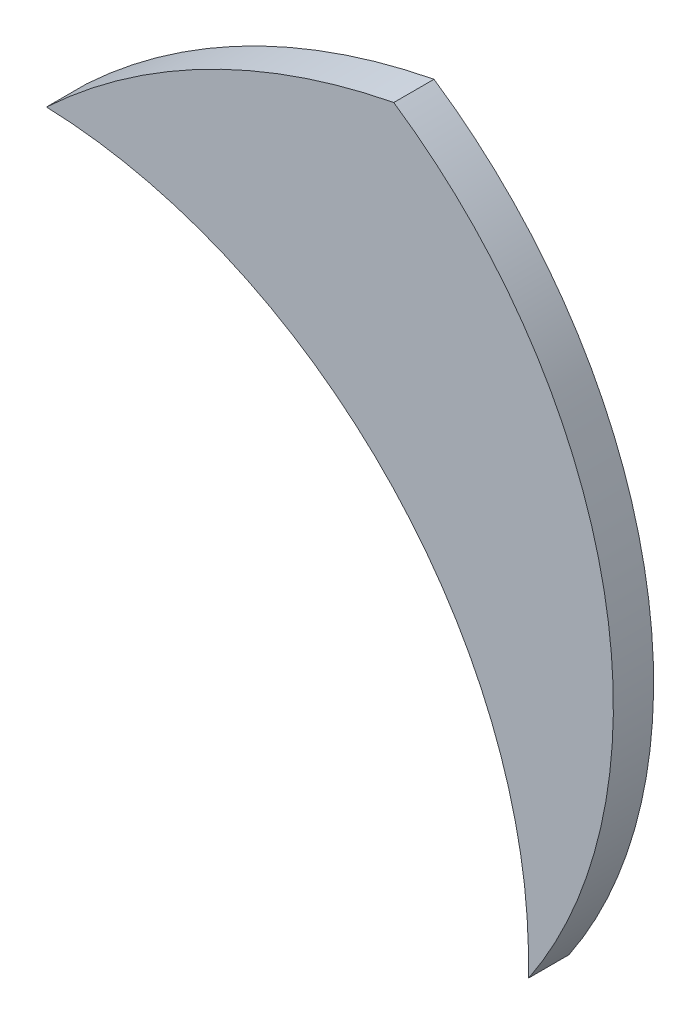
ISO-10303-21;
HEADER;
FILE_DESCRIPTION(('STEP AP214'),'2;1');
FILE_NAME('part.step','',(''),(''),'','','');
FILE_SCHEMA(('AUTOMOTIVE_DESIGN { 1 0 10303 214 1 1 1 1 }'));
ENDSEC;
DATA;
#1=APPLICATION_CONTEXT('core data for automotive mechanical design processes');
#2=APPLICATION_PROTOCOL_DEFINITION('international standard','automotive_design',2000,#1);
#3=PRODUCT_CONTEXT('',#1,'mechanical');
#4=PRODUCT('Part','Part','',(#3));
#5=PRODUCT_RELATED_PRODUCT_CATEGORY('part','',(#4));
#6=PRODUCT_DEFINITION_FORMATION('','',#4);
#7=PRODUCT_DEFINITION_CONTEXT('part definition',#1,'design');
#8=PRODUCT_DEFINITION('design','',#6,#7);
#9=PRODUCT_DEFINITION_SHAPE('','',#8);
#10=(LENGTH_UNIT() NAMED_UNIT(*) SI_UNIT(.MILLI.,.METRE.));
#11=(NAMED_UNIT(*) PLANE_ANGLE_UNIT() SI_UNIT($,.RADIAN.));
#12=(NAMED_UNIT(*) SI_UNIT($,.STERADIAN.) SOLID_ANGLE_UNIT());
#13=UNCERTAINTY_MEASURE_WITH_UNIT(LENGTH_MEASURE(1.E-05),#10,'distance_accuracy_value','');
#14=(GEOMETRIC_REPRESENTATION_CONTEXT(3) GLOBAL_UNCERTAINTY_ASSIGNED_CONTEXT((#13)) GLOBAL_UNIT_ASSIGNED_CONTEXT((#10,
#11,#12)) REPRESENTATION_CONTEXT('',''));
#15=CARTESIAN_POINT('',(0.,0.,0.));
#16=DIRECTION('',(0.,0.,1.));
#17=DIRECTION('',(1.,0.,0.));
#18=AXIS2_PLACEMENT_3D('',#15,#16,#17);
#19=CARTESIAN_POINT('',(-628.291119028019,20.2674554525163,50.8));
#20=DIRECTION('',(0.,0.,-1.));
#21=DIRECTION('',(-1.,0.,0.));
#22=AXIS2_PLACEMENT_3D('',#19,#20,#21);
#23=CYLINDRICAL_SURFACE('',#22,628.617928474841);
#24=CARTESIAN_POINT('',(-628.291119028019,20.2674554525163,0.));
#25=DIRECTION('',(0.,0.,-1.));
#26=DIRECTION('',(-1.,0.,0.));
#27=AXIS2_PLACEMENT_3D('',#24,#25,#26);
#28=CIRCLE('',#27,628.617928474841);
#29=CARTESIAN_POINT('',(-608.023663575502,648.558574480536,0.));
#30=VERTEX_POINT('',#29);
#31=CARTESIAN_POINT('',(0.0351263944543545,1.11988868026384,0.));
#32=VERTEX_POINT('',#31);
#33=EDGE_CURVE('E98',#30,#32,#28,.T.);
#34=ORIENTED_EDGE('',*,*,#33,.T.);
#35=DIRECTION('',(0.,0.,-1.));
#36=VECTOR('',#35,1.);
#37=CARTESIAN_POINT('',(0.0351263944543545,1.11988868026384,50.8));
#38=LINE('',#37,#36);
#39=CARTESIAN_POINT('',(0.0351263944543545,1.11988868026384,50.8));
#40=VERTEX_POINT('',#39);
#41=EDGE_CURVE('E11',#40,#32,#38,.T.);
#42=ORIENTED_EDGE('',*,*,#41,.F.);
#43=CARTESIAN_POINT('',(-628.291119028019,20.2674554525163,50.8));
#44=DIRECTION('',(0.,0.,-1.));
#45=DIRECTION('',(-1.,0.,0.));
#46=AXIS2_PLACEMENT_3D('',#43,#44,#45);
#47=CIRCLE('',#46,628.617928474841);
#48=CARTESIAN_POINT('',(-608.023663575502,648.558574480536,50.8));
#49=VERTEX_POINT('',#48);
#50=EDGE_CURVE('E86',#49,#40,#47,.T.);
#51=ORIENTED_EDGE('',*,*,#50,.F.);
#52=DIRECTION('',(0.,0.,-1.));
#53=VECTOR('',#52,1.);
#54=CARTESIAN_POINT('',(-608.023663575502,648.558574480536,50.8));
#55=LINE('',#54,#53);
#56=EDGE_CURVE('E94',#49,#30,#55,.T.);
#57=ORIENTED_EDGE('',*,*,#56,.T.);
#58=EDGE_LOOP('',(#34,#42,#51,#57));
#59=FACE_BOUND('',#58,.T.);
#60=ADVANCED_FACE('F35',(#59),#23,.F.);
#61=CARTESIAN_POINT('',(0.0351263944543545,1.11988868026384,50.8));
#62=DIRECTION('',(0.282780596720475,0.959184619412974,0.));
#63=DIRECTION('',(-0.959184619412974,0.282780596720475,0.));
#64=AXIS2_PLACEMENT_3D('',#61,#62,#63);
#65=PLANE('',#64);
#66=DIRECTION('',(0.959184619412974,-0.282780596720475,0.));
#67=VECTOR('',#66,1.);
#68=CARTESIAN_POINT('',(0.0351263944543545,1.11988868026384,0.));
#69=LINE('',#68,#67);
#70=CARTESIAN_POINT('',(0.634791512692634,0.943099294220873,0.));
#71=VERTEX_POINT('',#70);
#72=EDGE_CURVE('E90',#32,#71,#69,.T.);
#73=ORIENTED_EDGE('',*,*,#72,.T.);
#74=DIRECTION('',(0.,0.,-1.));
#75=VECTOR('',#74,1.);
#76=CARTESIAN_POINT('',(0.634791512692634,0.943099294220873,50.8));
#77=LINE('',#76,#75);
#78=CARTESIAN_POINT('',(0.634791512692634,0.943099294220873,50.8));
#79=VERTEX_POINT('',#78);
#80=EDGE_CURVE('E43',#79,#71,#77,.T.);
#81=ORIENTED_EDGE('',*,*,#80,.F.);
#82=DIRECTION('',(0.959184619412974,-0.282780596720475,0.));
#83=VECTOR('',#82,1.);
#84=CARTESIAN_POINT('',(0.0351263944543545,1.11988868026384,50.8));
#85=LINE('',#84,#83);
#86=EDGE_CURVE('E81',#40,#79,#85,.T.);
#87=ORIENTED_EDGE('',*,*,#86,.F.);
#88=ORIENTED_EDGE('',*,*,#41,.T.);
#89=EDGE_LOOP('',(#73,#81,#87,#88));
#90=FACE_BOUND('',#89,.T.);
#91=ADVANCED_FACE('F89',(#90),#65,.F.);
#92=CARTESIAN_POINT('',(-521.172756329221,351.481803313066,50.8));
#93=DIRECTION('',(0.,0.,-1.));
#94=DIRECTION('',(-1.,0.,0.));
#95=AXIS2_PLACEMENT_3D('',#92,#93,#94);
#96=CYLINDRICAL_SURFACE('',#95,628.617928474843);
#97=CARTESIAN_POINT('',(-521.172756329221,351.481803313066,0.));
#98=DIRECTION('',(0.,0.,1.));
#99=DIRECTION('',(1.,0.,0.));
#100=AXIS2_PLACEMENT_3D('',#97,#98,#99);
#101=CIRCLE('',#100,628.617928474843);
#102=CARTESIAN_POINT('',(-169.690953016152,872.654559642285,0.));
#103=VERTEX_POINT('',#102);
#104=EDGE_CURVE('E68',#71,#103,#101,.T.);
#105=ORIENTED_EDGE('',*,*,#104,.T.);
#106=DIRECTION('',(0.,0.,-1.));
#107=VECTOR('',#106,1.);
#108=CARTESIAN_POINT('',(-169.690953016152,872.654559642285,50.8));
#109=LINE('',#108,#107);
#110=CARTESIAN_POINT('',(-169.690953016152,872.654559642285,50.8));
#111=VERTEX_POINT('',#110);
#112=EDGE_CURVE('E91',#111,#103,#109,.T.);
#113=ORIENTED_EDGE('',*,*,#112,.F.);
#114=CARTESIAN_POINT('',(-521.172756329221,351.481803313066,50.8));
#115=DIRECTION('',(0.,0.,1.));
#116=DIRECTION('',(1.,0.,0.));
#117=AXIS2_PLACEMENT_3D('',#114,#115,#116);
#118=CIRCLE('',#117,628.617928474843);
#119=EDGE_CURVE('E84',#79,#111,#118,.T.);
#120=ORIENTED_EDGE('',*,*,#119,.F.);
#121=ORIENTED_EDGE('',*,*,#80,.T.);
#122=EDGE_LOOP('',(#105,#113,#120,#121));
#123=FACE_BOUND('',#122,.T.);
#124=ADVANCED_FACE('F92',(#123),#96,.T.);
#125=CARTESIAN_POINT('',(0.,0.,50.8));
#126=DIRECTION('',(0.,0.,-1.));
#127=DIRECTION('',(-1.,0.,0.));
#128=AXIS2_PLACEMENT_3D('',#125,#126,#127);
#129=CYLINDRICAL_SURFACE('',#128,889.);
#130=CARTESIAN_POINT('',(0.,0.,0.));
#131=DIRECTION('',(0.,0.,1.));
#132=DIRECTION('',(1.,0.,0.));
#133=AXIS2_PLACEMENT_3D('',#130,#131,#132);
#134=CIRCLE('',#133,889.);
#135=EDGE_CURVE('E74',#103,#30,#134,.T.);
#136=ORIENTED_EDGE('',*,*,#135,.T.);
#137=ORIENTED_EDGE('',*,*,#56,.F.);
#138=CARTESIAN_POINT('',(0.,0.,50.8));
#139=DIRECTION('',(0.,0.,1.));
#140=DIRECTION('',(1.,0.,0.));
#141=AXIS2_PLACEMENT_3D('',#138,#139,#140);
#142=CIRCLE('',#141,889.);
#143=EDGE_CURVE('E51',#111,#49,#142,.T.);
#144=ORIENTED_EDGE('',*,*,#143,.F.);
#145=ORIENTED_EDGE('',*,*,#112,.T.);
#146=EDGE_LOOP('',(#136,#137,#144,#145));
#147=FACE_BOUND('',#146,.T.);
#148=ADVANCED_FACE('F105',(#147),#129,.T.);
#149=CARTESIAN_POINT('',(-628.291119028019,20.2674554525163,50.8));
#150=DIRECTION('',(0.,0.,-1.));
#151=DIRECTION('',(-1.,0.,0.));
#152=AXIS2_PLACEMENT_3D('',#149,#150,#151);
#153=PLANE('',#152);
#154=ORIENTED_EDGE('',*,*,#50,.T.);
#155=ORIENTED_EDGE('',*,*,#86,.T.);
#156=ORIENTED_EDGE('',*,*,#119,.T.);
#157=ORIENTED_EDGE('',*,*,#143,.T.);
#158=EDGE_LOOP('',(#154,#155,#156,#157));
#159=FACE_BOUND('',#158,.T.);
#160=ADVANCED_FACE('F82',(#159),#153,.F.);
#161=CARTESIAN_POINT('',(-628.291119028019,20.2674554525163,0.));
#162=DIRECTION('',(0.,0.,-1.));
#163=DIRECTION('',(-1.,0.,0.));
#164=AXIS2_PLACEMENT_3D('',#161,#162,#163);
#165=PLANE('',#164);
#166=ORIENTED_EDGE('',*,*,#33,.F.);
#167=ORIENTED_EDGE('',*,*,#135,.F.);
#168=ORIENTED_EDGE('',*,*,#104,.F.);
#169=ORIENTED_EDGE('',*,*,#72,.F.);
#170=EDGE_LOOP('',(#166,#167,#168,#169));
#171=FACE_BOUND('',#170,.T.);
#172=ADVANCED_FACE('F108',(#171),#165,.T.);
#173=CLOSED_SHELL('',(#60,#91,#124,#148,#160,#172));
#174=MANIFOLD_SOLID_BREP('B2',#173);
#175=ADVANCED_BREP_SHAPE_REPRESENTATION('',(#18,#174),#14);
#176=SHAPE_DEFINITION_REPRESENTATION(#9,#175);
ENDSEC;
END-ISO-10303-21;
